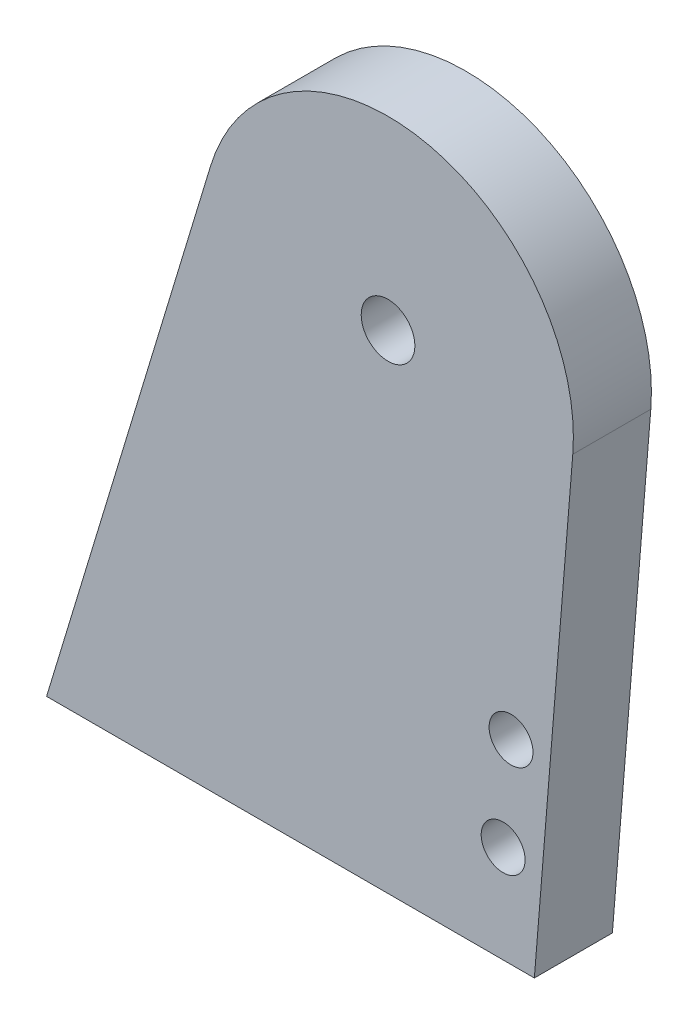
ISO-10303-21;
HEADER;
FILE_DESCRIPTION(('STEP AP214'),'2;1');
FILE_NAME('part.step','',(''),(''),'','','');
FILE_SCHEMA(('AUTOMOTIVE_DESIGN { 1 0 10303 214 1 1 1 1 }'));
ENDSEC;
DATA;
#1=APPLICATION_CONTEXT('core data for automotive mechanical design processes');
#2=APPLICATION_PROTOCOL_DEFINITION('international standard','automotive_design',2000,#1);
#3=PRODUCT_CONTEXT('',#1,'mechanical');
#4=PRODUCT('Part','Part','',(#3));
#5=PRODUCT_RELATED_PRODUCT_CATEGORY('part','',(#4));
#6=PRODUCT_DEFINITION_FORMATION('','',#4);
#7=PRODUCT_DEFINITION_CONTEXT('part definition',#1,'design');
#8=PRODUCT_DEFINITION('design','',#6,#7);
#9=PRODUCT_DEFINITION_SHAPE('','',#8);
#10=(LENGTH_UNIT() NAMED_UNIT(*) SI_UNIT(.MILLI.,.METRE.));
#11=(NAMED_UNIT(*) PLANE_ANGLE_UNIT() SI_UNIT($,.RADIAN.));
#12=(NAMED_UNIT(*) SI_UNIT($,.STERADIAN.) SOLID_ANGLE_UNIT());
#13=UNCERTAINTY_MEASURE_WITH_UNIT(LENGTH_MEASURE(1.E-05),#10,'distance_accuracy_value','');
#14=(GEOMETRIC_REPRESENTATION_CONTEXT(3) GLOBAL_UNCERTAINTY_ASSIGNED_CONTEXT((#13)) GLOBAL_UNIT_ASSIGNED_CONTEXT((#10,
#11,#12)) REPRESENTATION_CONTEXT('',''));
#15=CARTESIAN_POINT('',(0.,0.,0.));
#16=DIRECTION('',(0.,0.,1.));
#17=DIRECTION('',(1.,0.,0.));
#18=AXIS2_PLACEMENT_3D('',#15,#16,#17);
#19=CARTESIAN_POINT('',(49.6720681360177,-4.03597000629349,8.));
#20=DIRECTION('',(-0.99671528668941,0.0809854139931767,0.));
#21=DIRECTION('',(-0.0809854139931767,-0.996715286689411,0.));
#22=AXIS2_PLACEMENT_3D('',#19,#20,#21);
#23=PLANE('',#22);
#24=DIRECTION('',(0.0809854139931767,0.996715286689411,0.));
#25=VECTOR('',#24,1.);
#26=CARTESIAN_POINT('',(49.6720681360177,-4.03597000629349,0.));
#27=LINE('',#26,#25);
#28=CARTESIAN_POINT('',(50.,0.,0.));
#29=VERTEX_POINT('',#28);
#30=CARTESIAN_POINT('',(53.9375904470988,48.4612771341296,0.));
#31=VERTEX_POINT('',#30);
#32=EDGE_CURVE('E129',#29,#31,#27,.T.);
#33=ORIENTED_EDGE('',*,*,#32,.T.);
#34=DIRECTION('',(0.,0.,-1.));
#35=VECTOR('',#34,1.);
#36=CARTESIAN_POINT('',(53.9375904470988,48.4612771341296,8.));
#37=LINE('',#36,#35);
#38=CARTESIAN_POINT('',(53.9375904470988,48.4612771341296,8.));
#39=VERTEX_POINT('',#38);
#40=EDGE_CURVE('E11',#39,#31,#37,.T.);
#41=ORIENTED_EDGE('',*,*,#40,.F.);
#42=DIRECTION('',(0.0809854139931767,0.996715286689411,0.));
#43=VECTOR('',#42,1.);
#44=CARTESIAN_POINT('',(49.6720681360177,-4.03597000629349,8.));
#45=LINE('',#44,#43);
#46=CARTESIAN_POINT('',(50.,0.,8.));
#47=VERTEX_POINT('',#46);
#48=EDGE_CURVE('E130',#47,#39,#45,.T.);
#49=ORIENTED_EDGE('',*,*,#48,.F.);
#50=DIRECTION('',(0.,0.,-1.));
#51=VECTOR('',#50,1.);
#52=CARTESIAN_POINT('',(50.,0.,8.));
#53=LINE('',#52,#51);
#54=EDGE_CURVE('E137',#47,#29,#53,.T.);
#55=ORIENTED_EDGE('',*,*,#54,.T.);
#56=EDGE_LOOP('',(#33,#41,#49,#55));
#57=FACE_BOUND('',#56,.T.);
#58=ADVANCED_FACE('F41',(#57),#23,.F.);
#59=CARTESIAN_POINT('',(35.,50.,8.));
#60=DIRECTION('',(0.,0.,-1.));
#61=DIRECTION('',(-1.,0.,0.));
#62=AXIS2_PLACEMENT_3D('',#59,#60,#61);
#63=CYLINDRICAL_SURFACE('',#62,19.);
#64=CARTESIAN_POINT('',(35.,50.,0.));
#65=DIRECTION('',(0.,0.,1.));
#66=DIRECTION('',(1.,0.,0.));
#67=AXIS2_PLACEMENT_3D('',#64,#65,#66);
#68=CIRCLE('',#67,19.);
#69=CARTESIAN_POINT('',(16.8161073825503,55.5087248322148,0.));
#70=VERTEX_POINT('',#69);
#71=EDGE_CURVE('E140',#31,#70,#68,.T.);
#72=ORIENTED_EDGE('',*,*,#71,.T.);
#73=DIRECTION('',(0.,0.,-1.));
#74=VECTOR('',#73,1.);
#75=CARTESIAN_POINT('',(16.8161073825503,55.5087248322148,8.));
#76=LINE('',#75,#74);
#77=CARTESIAN_POINT('',(16.8161073825503,55.5087248322148,8.));
#78=VERTEX_POINT('',#77);
#79=EDGE_CURVE('E49',#78,#70,#76,.T.);
#80=ORIENTED_EDGE('',*,*,#79,.F.);
#81=CARTESIAN_POINT('',(35.,50.,8.));
#82=DIRECTION('',(0.,0.,1.));
#83=DIRECTION('',(1.,0.,0.));
#84=AXIS2_PLACEMENT_3D('',#81,#82,#83);
#85=CIRCLE('',#84,19.);
#86=EDGE_CURVE('E84',#39,#78,#85,.T.);
#87=ORIENTED_EDGE('',*,*,#86,.F.);
#88=ORIENTED_EDGE('',*,*,#40,.T.);
#89=EDGE_LOOP('',(#72,#80,#87,#88));
#90=FACE_BOUND('',#89,.T.);
#91=ADVANCED_FACE('F151',(#90),#63,.T.);
#92=CARTESIAN_POINT('',(0.,0.,8.));
#93=DIRECTION('',(-0.957046979865772,0.28993288590604,0.));
#94=DIRECTION('',(-0.28993288590604,-0.957046979865772,0.));
#95=AXIS2_PLACEMENT_3D('',#92,#93,#94);
#96=PLANE('',#95);
#97=DIRECTION('',(0.28993288590604,0.957046979865772,0.));
#98=VECTOR('',#97,1.);
#99=CARTESIAN_POINT('',(0.,0.,0.));
#100=LINE('',#99,#98);
#101=CARTESIAN_POINT('',(0.,0.,0.));
#102=VERTEX_POINT('',#101);
#103=EDGE_CURVE('E143',#102,#70,#100,.T.);
#104=ORIENTED_EDGE('',*,*,#103,.F.);
#105=DIRECTION('',(0.,0.,-1.));
#106=VECTOR('',#105,1.);
#107=CARTESIAN_POINT('',(0.,0.,8.));
#108=LINE('',#107,#106);
#109=CARTESIAN_POINT('',(0.,0.,8.));
#110=VERTEX_POINT('',#109);
#111=EDGE_CURVE('E74',#110,#102,#108,.T.);
#112=ORIENTED_EDGE('',*,*,#111,.F.);
#113=DIRECTION('',(0.28993288590604,0.957046979865772,0.));
#114=VECTOR('',#113,1.);
#115=CARTESIAN_POINT('',(0.,0.,8.));
#116=LINE('',#115,#114);
#117=EDGE_CURVE('E133',#110,#78,#116,.T.);
#118=ORIENTED_EDGE('',*,*,#117,.T.);
#119=ORIENTED_EDGE('',*,*,#79,.T.);
#120=EDGE_LOOP('',(#104,#112,#118,#119));
#121=FACE_BOUND('',#120,.T.);
#122=ADVANCED_FACE('F150',(#121),#96,.T.);
#123=CARTESIAN_POINT('',(0.,0.,8.));
#124=DIRECTION('',(0.,1.,0.));
#125=DIRECTION('',(0.,0.,1.));
#126=AXIS2_PLACEMENT_3D('',#123,#124,#125);
#127=PLANE('',#126);
#128=CARTESIAN_POINT('',(10.,0.,4.));
#129=DIRECTION('',(0.,-1.,0.));
#130=DIRECTION('',(0.,0.,-1.));
#131=AXIS2_PLACEMENT_3D('',#128,#129,#130);
#132=CIRCLE('',#131,1.525);
#133=CARTESIAN_POINT('',(10.,0.,2.475));
#134=VERTEX_POINT('',#133);
#135=EDGE_CURVE('E108',#134,#134,#132,.T.);
#136=ORIENTED_EDGE('',*,*,#135,.F.);
#137=EDGE_LOOP('',(#136));
#138=FACE_BOUND('',#137,.T.);
#139=CARTESIAN_POINT('',(40.,0.,4.));
#140=DIRECTION('',(0.,-1.,0.));
#141=DIRECTION('',(0.,0.,-1.));
#142=AXIS2_PLACEMENT_3D('',#139,#140,#141);
#143=CIRCLE('',#142,1.525);
#144=CARTESIAN_POINT('',(40.,0.,2.475));
#145=VERTEX_POINT('',#144);
#146=EDGE_CURVE('E101',#145,#145,#143,.T.);
#147=ORIENTED_EDGE('',*,*,#146,.F.);
#148=EDGE_LOOP('',(#147));
#149=FACE_BOUND('',#148,.T.);
#150=DIRECTION('',(1.,0.,0.));
#151=VECTOR('',#150,1.);
#152=CARTESIAN_POINT('',(0.,0.,0.));
#153=LINE('',#152,#151);
#154=EDGE_CURVE('E77',#102,#29,#153,.T.);
#155=ORIENTED_EDGE('',*,*,#154,.T.);
#156=ORIENTED_EDGE('',*,*,#54,.F.);
#157=DIRECTION('',(1.,0.,0.));
#158=VECTOR('',#157,1.);
#159=CARTESIAN_POINT('',(0.,0.,8.));
#160=LINE('',#159,#158);
#161=EDGE_CURVE('E57',#110,#47,#160,.T.);
#162=ORIENTED_EDGE('',*,*,#161,.F.);
#163=ORIENTED_EDGE('',*,*,#111,.T.);
#164=EDGE_LOOP('',(#155,#156,#162,#163));
#165=FACE_BOUND('',#164,.T.);
#166=ADVANCED_FACE('F158',(#138,#149,#165),#127,.F.);
#167=CARTESIAN_POINT('',(0.,0.,8.));
#168=DIRECTION('',(0.,0.,1.));
#169=DIRECTION('',(1.,0.,0.));
#170=AXIS2_PLACEMENT_3D('',#167,#168,#169);
#171=PLANE('',#170);
#172=CARTESIAN_POINT('',(35.,50.,8.));
#173=DIRECTION('',(0.,0.,-1.));
#174=DIRECTION('',(-1.,0.,0.));
#175=AXIS2_PLACEMENT_3D('',#172,#173,#174);
#176=CIRCLE('',#175,2.75);
#177=CARTESIAN_POINT('',(32.25,50.,8.));
#178=VERTEX_POINT('',#177);
#179=EDGE_CURVE('E342',#178,#178,#176,.T.);
#180=ORIENTED_EDGE('',*,*,#179,.T.);
#181=EDGE_LOOP('',(#180));
#182=FACE_BOUND('',#181,.T.);
#183=CARTESIAN_POINT('',(46.7993408923582,10.,8.));
#184=DIRECTION('',(0.,0.,1.));
#185=DIRECTION('',(1.,0.,0.));
#186=AXIS2_PLACEMENT_3D('',#183,#184,#185);
#187=CIRCLE('',#186,2.24999999999999);
#188=CARTESIAN_POINT('',(49.0493408923582,10.,8.));
#189=VERTEX_POINT('',#188);
#190=EDGE_CURVE('E117',#189,#189,#187,.T.);
#191=ORIENTED_EDGE('',*,*,#190,.F.);
#192=EDGE_LOOP('',(#191));
#193=FACE_BOUND('',#192,.T.);
#194=CARTESIAN_POINT('',(47.60919503229,19.9671528668941,8.));
#195=DIRECTION('',(0.,0.,1.));
#196=DIRECTION('',(1.,0.,0.));
#197=AXIS2_PLACEMENT_3D('',#194,#195,#196);
#198=CIRCLE('',#197,2.24999999999999);
#199=CARTESIAN_POINT('',(49.85919503229,19.9671528668941,8.));
#200=VERTEX_POINT('',#199);
#201=EDGE_CURVE('E123',#200,#200,#198,.T.);
#202=ORIENTED_EDGE('',*,*,#201,.F.);
#203=EDGE_LOOP('',(#202));
#204=FACE_BOUND('',#203,.T.);
#205=ORIENTED_EDGE('',*,*,#48,.T.);
#206=ORIENTED_EDGE('',*,*,#86,.T.);
#207=ORIENTED_EDGE('',*,*,#117,.F.);
#208=ORIENTED_EDGE('',*,*,#161,.T.);
#209=EDGE_LOOP('',(#205,#206,#207,#208));
#210=FACE_BOUND('',#209,.T.);
#211=ADVANCED_FACE('F159',(#182,#193,#204,#210),#171,.T.);
#212=CARTESIAN_POINT('',(0.,0.,0.));
#213=DIRECTION('',(0.,0.,1.));
#214=DIRECTION('',(1.,0.,0.));
#215=AXIS2_PLACEMENT_3D('',#212,#213,#214);
#216=PLANE('',#215);
#217=CARTESIAN_POINT('',(35.,50.,0.));
#218=DIRECTION('',(0.,0.,-1.));
#219=DIRECTION('',(-1.,0.,0.));
#220=AXIS2_PLACEMENT_3D('',#217,#218,#219);
#221=CIRCLE('',#220,2.74999999999989);
#222=CARTESIAN_POINT('',(32.2500000000001,50.,0.));
#223=VERTEX_POINT('',#222);
#224=EDGE_CURVE('E345',#223,#223,#221,.T.);
#225=ORIENTED_EDGE('',*,*,#224,.F.);
#226=EDGE_LOOP('',(#225));
#227=FACE_BOUND('',#226,.T.);
#228=CARTESIAN_POINT('',(46.7993408923582,10.,0.));
#229=DIRECTION('',(0.,0.,1.));
#230=DIRECTION('',(1.,0.,0.));
#231=AXIS2_PLACEMENT_3D('',#228,#229,#230);
#232=CIRCLE('',#231,2.24999999999999);
#233=CARTESIAN_POINT('',(49.0493408923582,10.,0.));
#234=VERTEX_POINT('',#233);
#235=EDGE_CURVE('E120',#234,#234,#232,.T.);
#236=ORIENTED_EDGE('',*,*,#235,.T.);
#237=EDGE_LOOP('',(#236));
#238=FACE_BOUND('',#237,.T.);
#239=CARTESIAN_POINT('',(47.60919503229,19.9671528668941,0.));
#240=DIRECTION('',(0.,0.,1.));
#241=DIRECTION('',(1.,0.,0.));
#242=AXIS2_PLACEMENT_3D('',#239,#240,#241);
#243=CIRCLE('',#242,2.25);
#244=CARTESIAN_POINT('',(49.85919503229,19.9671528668941,0.));
#245=VERTEX_POINT('',#244);
#246=EDGE_CURVE('E126',#245,#245,#243,.T.);
#247=ORIENTED_EDGE('',*,*,#246,.T.);
#248=EDGE_LOOP('',(#247));
#249=FACE_BOUND('',#248,.T.);
#250=ORIENTED_EDGE('',*,*,#32,.F.);
#251=ORIENTED_EDGE('',*,*,#154,.F.);
#252=ORIENTED_EDGE('',*,*,#103,.T.);
#253=ORIENTED_EDGE('',*,*,#71,.F.);
#254=EDGE_LOOP('',(#250,#251,#252,#253));
#255=FACE_BOUND('',#254,.T.);
#256=ADVANCED_FACE('F155',(#227,#238,#249,#255),#216,.F.);
#257=CARTESIAN_POINT('',(47.60919503229,19.9671528668941,8.));
#258=DIRECTION('',(0.,0.,1.));
#259=DIRECTION('',(1.,0.,0.));
#260=AXIS2_PLACEMENT_3D('',#257,#258,#259);
#261=CYLINDRICAL_SURFACE('',#260,2.25);
#262=ORIENTED_EDGE('',*,*,#246,.F.);
#263=EDGE_LOOP('',(#262));
#264=FACE_BOUND('',#263,.T.);
#265=ORIENTED_EDGE('',*,*,#201,.T.);
#266=EDGE_LOOP('',(#265));
#267=FACE_BOUND('',#266,.T.);
#268=ADVANCED_FACE('F167',(#264,#267),#261,.F.);
#269=CARTESIAN_POINT('',(46.7993408923582,10.,8.));
#270=DIRECTION('',(0.,0.,1.));
#271=DIRECTION('',(1.,0.,0.));
#272=AXIS2_PLACEMENT_3D('',#269,#270,#271);
#273=CYLINDRICAL_SURFACE('',#272,2.24999999999999);
#274=ORIENTED_EDGE('',*,*,#235,.F.);
#275=EDGE_LOOP('',(#274));
#276=FACE_BOUND('',#275,.T.);
#277=ORIENTED_EDGE('',*,*,#190,.T.);
#278=EDGE_LOOP('',(#277));
#279=FACE_BOUND('',#278,.T.);
#280=ADVANCED_FACE('F283',(#276,#279),#273,.F.);
#281=CARTESIAN_POINT('',(40.,8.49999999999999,4.));
#282=DIRECTION('',(0.,-1.,0.));
#283=DIRECTION('',(0.,0.,-1.));
#284=AXIS2_PLACEMENT_3D('',#281,#282,#283);
#285=CONICAL_SURFACE('',#284,1.24999999999999,1.02974425867665);
#286=CARTESIAN_POINT('',(40.,9.25107577378444,4.));
#287=VERTEX_POINT('',#286);
#288=VERTEX_LOOP('',#287);
#289=FACE_BOUND('',#288,.T.);
#290=CARTESIAN_POINT('',(40.,8.49999999999999,4.));
#291=DIRECTION('',(0.,-1.,0.));
#292=DIRECTION('',(0.,0.,-1.));
#293=AXIS2_PLACEMENT_3D('',#290,#291,#292);
#294=CIRCLE('',#293,1.24999999999999);
#295=CARTESIAN_POINT('',(40.,8.49999999999999,2.75000000000001));
#296=VERTEX_POINT('',#295);
#297=EDGE_CURVE('E114',#296,#296,#294,.T.);
#298=ORIENTED_EDGE('',*,*,#297,.T.);
#299=EDGE_LOOP('',(#298));
#300=FACE_BOUND('',#299,.T.);
#301=ADVANCED_FACE('F207',(#289,#300),#285,.F.);
#302=CARTESIAN_POINT('',(40.,0.,4.));
#303=DIRECTION('',(0.,-1.,0.));
#304=DIRECTION('',(0.,0.,-1.));
#305=AXIS2_PLACEMENT_3D('',#302,#303,#304);
#306=CYLINDRICAL_SURFACE('',#305,1.24999999999999);
#307=ORIENTED_EDGE('',*,*,#297,.F.);
#308=EDGE_LOOP('',(#307));
#309=FACE_BOUND('',#308,.T.);
#310=CARTESIAN_POINT('',(40.,0.275000000000001,4.));
#311=DIRECTION('',(0.,-1.,0.));
#312=DIRECTION('',(0.,0.,-1.));
#313=AXIS2_PLACEMENT_3D('',#310,#311,#312);
#314=CIRCLE('',#313,1.25);
#315=CARTESIAN_POINT('',(40.,0.275000000000001,2.75));
#316=VERTEX_POINT('',#315);
#317=EDGE_CURVE('E105',#316,#316,#314,.T.);
#318=ORIENTED_EDGE('',*,*,#317,.T.);
#319=EDGE_LOOP('',(#318));
#320=FACE_BOUND('',#319,.T.);
#321=ADVANCED_FACE('F202',(#309,#320),#306,.F.);
#322=CARTESIAN_POINT('',(40.,0.,4.));
#323=DIRECTION('',(0.,-1.,0.));
#324=DIRECTION('',(0.,0.,-1.));
#325=AXIS2_PLACEMENT_3D('',#322,#323,#324);
#326=CONICAL_SURFACE('',#325,1.525,0.785398163397439);
#327=ORIENTED_EDGE('',*,*,#317,.F.);
#328=EDGE_LOOP('',(#327));
#329=FACE_BOUND('',#328,.T.);
#330=ORIENTED_EDGE('',*,*,#146,.T.);
#331=EDGE_LOOP('',(#330));
#332=FACE_BOUND('',#331,.T.);
#333=ADVANCED_FACE('F95',(#329,#332),#326,.F.);
#334=CARTESIAN_POINT('',(10.,8.49999999999999,4.));
#335=DIRECTION('',(0.,-1.,0.));
#336=DIRECTION('',(0.,0.,-1.));
#337=AXIS2_PLACEMENT_3D('',#334,#335,#336);
#338=CONICAL_SURFACE('',#337,1.24999999999999,1.02974425867665);
#339=CARTESIAN_POINT('',(10.,9.25107577378444,4.));
#340=VERTEX_POINT('',#339);
#341=VERTEX_LOOP('',#340);
#342=FACE_BOUND('',#341,.T.);
#343=CARTESIAN_POINT('',(10.,8.49999999999999,4.));
#344=DIRECTION('',(0.,-1.,0.));
#345=DIRECTION('',(0.,0.,-1.));
#346=AXIS2_PLACEMENT_3D('',#343,#344,#345);
#347=CIRCLE('',#346,1.24999999999999);
#348=CARTESIAN_POINT('',(10.,8.49999999999999,2.75000000000001));
#349=VERTEX_POINT('',#348);
#350=EDGE_CURVE('E99',#349,#349,#347,.T.);
#351=ORIENTED_EDGE('',*,*,#350,.T.);
#352=EDGE_LOOP('',(#351));
#353=FACE_BOUND('',#352,.T.);
#354=ADVANCED_FACE('F91',(#342,#353),#338,.F.);
#355=CARTESIAN_POINT('',(10.,0.,4.));
#356=DIRECTION('',(0.,-1.,0.));
#357=DIRECTION('',(0.,0.,-1.));
#358=AXIS2_PLACEMENT_3D('',#355,#356,#357);
#359=CYLINDRICAL_SURFACE('',#358,1.24999999999999);
#360=ORIENTED_EDGE('',*,*,#350,.F.);
#361=EDGE_LOOP('',(#360));
#362=FACE_BOUND('',#361,.T.);
#363=CARTESIAN_POINT('',(10.,0.275000000000001,4.));
#364=DIRECTION('',(0.,-1.,0.));
#365=DIRECTION('',(0.,0.,-1.));
#366=AXIS2_PLACEMENT_3D('',#363,#364,#365);
#367=CIRCLE('',#366,1.25);
#368=CARTESIAN_POINT('',(10.,0.275000000000001,2.75));
#369=VERTEX_POINT('',#368);
#370=EDGE_CURVE('E102',#369,#369,#367,.T.);
#371=ORIENTED_EDGE('',*,*,#370,.T.);
#372=EDGE_LOOP('',(#371));
#373=FACE_BOUND('',#372,.T.);
#374=ADVANCED_FACE('F94',(#362,#373),#359,.F.);
#375=CARTESIAN_POINT('',(10.,0.,4.));
#376=DIRECTION('',(0.,-1.,0.));
#377=DIRECTION('',(0.,0.,-1.));
#378=AXIS2_PLACEMENT_3D('',#375,#376,#377);
#379=CONICAL_SURFACE('',#378,1.525,0.785398163397445);
#380=ORIENTED_EDGE('',*,*,#370,.F.);
#381=EDGE_LOOP('',(#380));
#382=FACE_BOUND('',#381,.T.);
#383=ORIENTED_EDGE('',*,*,#135,.T.);
#384=EDGE_LOOP('',(#383));
#385=FACE_BOUND('',#384,.T.);
#386=ADVANCED_FACE('F198',(#382,#385),#379,.F.);
#387=CARTESIAN_POINT('',(35.,50.,0.));
#388=DIRECTION('',(0.,0.,-1.));
#389=DIRECTION('',(-1.,0.,0.));
#390=AXIS2_PLACEMENT_3D('',#387,#388,#389);
#391=CYLINDRICAL_SURFACE('',#390,2.74999999999994);
#392=ORIENTED_EDGE('',*,*,#179,.F.);
#393=EDGE_LOOP('',(#392));
#394=FACE_BOUND('',#393,.T.);
#395=ORIENTED_EDGE('',*,*,#224,.T.);
#396=EDGE_LOOP('',(#395));
#397=FACE_BOUND('',#396,.T.);
#398=ADVANCED_FACE('F225',(#394,#397),#391,.F.);
#399=CLOSED_SHELL('',(#58,#91,#122,#166,#211,#256,#268,#280,#301,#321,#333,#354,#374,#386,#398));
#400=MANIFOLD_SOLID_BREP('B2',#399);
#401=ADVANCED_BREP_SHAPE_REPRESENTATION('',(#18,#400),#14);
#402=SHAPE_DEFINITION_REPRESENTATION(#9,#401);
ENDSEC;
END-ISO-10303-21;
